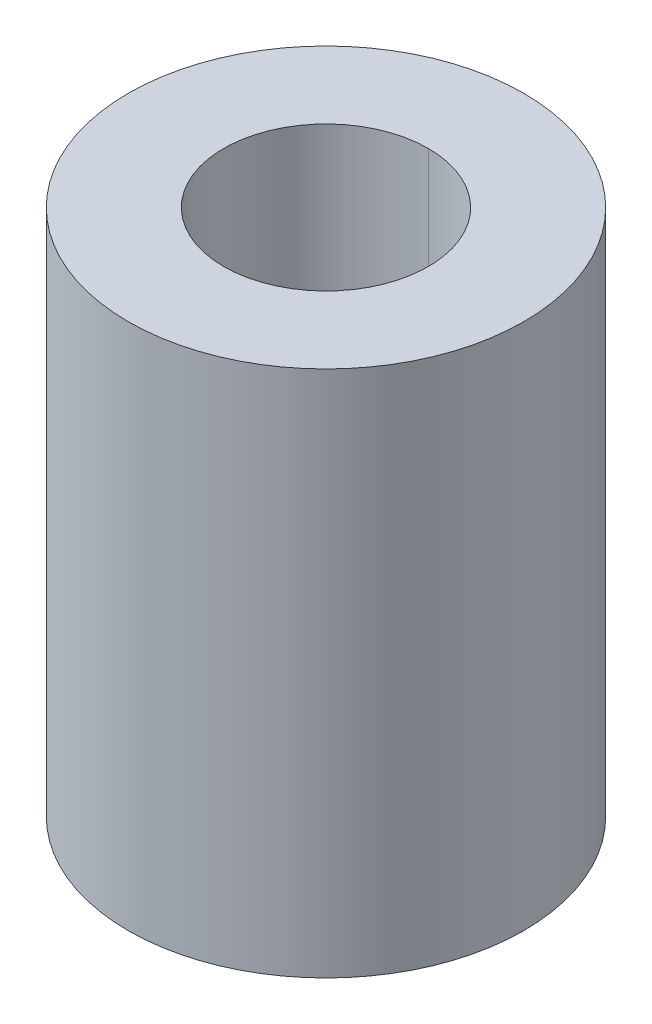
ISO-10303-21;
HEADER;
FILE_DESCRIPTION(('STEP AP214'),'2;1');
FILE_NAME('part.step','',(''),(''),'','','');
FILE_SCHEMA(('AUTOMOTIVE_DESIGN { 1 0 10303 214 1 1 1 1 }'));
ENDSEC;
DATA;
#1=APPLICATION_CONTEXT('core data for automotive mechanical design processes');
#2=APPLICATION_PROTOCOL_DEFINITION('international standard','automotive_design',2000,#1);
#3=PRODUCT_CONTEXT('',#1,'mechanical');
#4=PRODUCT('Part','Part','',(#3));
#5=PRODUCT_RELATED_PRODUCT_CATEGORY('part','',(#4));
#6=PRODUCT_DEFINITION_FORMATION('','',#4);
#7=PRODUCT_DEFINITION_CONTEXT('part definition',#1,'design');
#8=PRODUCT_DEFINITION('design','',#6,#7);
#9=PRODUCT_DEFINITION_SHAPE('','',#8);
#10=(LENGTH_UNIT() NAMED_UNIT(*) SI_UNIT(.MILLI.,.METRE.));
#11=(NAMED_UNIT(*) PLANE_ANGLE_UNIT() SI_UNIT($,.RADIAN.));
#12=(NAMED_UNIT(*) SI_UNIT($,.STERADIAN.) SOLID_ANGLE_UNIT());
#13=UNCERTAINTY_MEASURE_WITH_UNIT(LENGTH_MEASURE(1.E-05),#10,'distance_accuracy_value','');
#14=(GEOMETRIC_REPRESENTATION_CONTEXT(3) GLOBAL_UNCERTAINTY_ASSIGNED_CONTEXT((#13)) GLOBAL_UNIT_ASSIGNED_CONTEXT((#10,
#11,#12)) REPRESENTATION_CONTEXT('',''));
#15=CARTESIAN_POINT('',(0.,0.,0.));
#16=DIRECTION('',(0.,0.,1.));
#17=DIRECTION('',(1.,0.,0.));
#18=AXIS2_PLACEMENT_3D('',#15,#16,#17);
#19=CARTESIAN_POINT('',(0.,6.35,0.));
#20=DIRECTION('',(0.,1.,0.));
#21=DIRECTION('',(1.,0.,0.));
#22=AXIS2_PLACEMENT_3D('',#19,#20,#21);
#23=PLANE('',#22);
#24=CARTESIAN_POINT('',(0.,6.35,0.));
#25=DIRECTION('',(0.,1.,0.));
#26=DIRECTION('',(0.,0.,1.));
#27=AXIS2_PLACEMENT_3D('',#24,#25,#26);
#28=CIRCLE('',#27,2.4638);
#29=CARTESIAN_POINT('',(0.,6.35,-2.4638));
#30=VERTEX_POINT('',#29);
#31=CARTESIAN_POINT('',(0.,6.35,2.4638));
#32=VERTEX_POINT('',#31);
#33=EDGE_CURVE('E61',#30,#32,#28,.T.);
#34=ORIENTED_EDGE('',*,*,#33,.F.);
#35=CARTESIAN_POINT('',(0.,6.35,0.));
#36=DIRECTION('',(0.,1.,0.));
#37=DIRECTION('',(0.,0.,1.));
#38=AXIS2_PLACEMENT_3D('',#35,#36,#37);
#39=CIRCLE('',#38,2.4638);
#40=EDGE_CURVE('E11',#32,#30,#39,.T.);
#41=ORIENTED_EDGE('',*,*,#40,.F.);
#42=EDGE_LOOP('',(#34,#41));
#43=FACE_BOUND('',#42,.T.);
#44=CARTESIAN_POINT('',(0.,6.35,0.));
#45=DIRECTION('',(0.,1.,0.));
#46=DIRECTION('',(0.,0.,1.));
#47=AXIS2_PLACEMENT_3D('',#44,#45,#46);
#48=CIRCLE('',#47,4.7625);
#49=CARTESIAN_POINT('',(0.,6.35,4.7625));
#50=VERTEX_POINT('',#49);
#51=EDGE_CURVE('E98',#50,#50,#48,.T.);
#52=ORIENTED_EDGE('',*,*,#51,.T.);
#53=EDGE_LOOP('',(#52));
#54=FACE_BOUND('',#53,.T.);
#55=ADVANCED_FACE('F42',(#43,#54),#23,.T.);
#56=CARTESIAN_POINT('',(0.,-6.35,0.));
#57=DIRECTION('',(0.,1.,0.));
#58=DIRECTION('',(1.,0.,0.));
#59=AXIS2_PLACEMENT_3D('',#56,#57,#58);
#60=PLANE('',#59);
#61=CARTESIAN_POINT('',(0.,-6.35,0.));
#62=DIRECTION('',(0.,1.,0.));
#63=DIRECTION('',(0.,0.,1.));
#64=AXIS2_PLACEMENT_3D('',#61,#62,#63);
#65=CIRCLE('',#64,2.4638);
#66=CARTESIAN_POINT('',(0.,-6.35,-2.4638));
#67=VERTEX_POINT('',#66);
#68=CARTESIAN_POINT('',(0.,-6.35,2.4638));
#69=VERTEX_POINT('',#68);
#70=EDGE_CURVE('E84',#67,#69,#65,.T.);
#71=ORIENTED_EDGE('',*,*,#70,.T.);
#72=CARTESIAN_POINT('',(0.,-6.35,0.));
#73=DIRECTION('',(0.,1.,0.));
#74=DIRECTION('',(0.,0.,1.));
#75=AXIS2_PLACEMENT_3D('',#72,#73,#74);
#76=CIRCLE('',#75,2.4638);
#77=EDGE_CURVE('E46',#69,#67,#76,.T.);
#78=ORIENTED_EDGE('',*,*,#77,.T.);
#79=EDGE_LOOP('',(#71,#78));
#80=FACE_BOUND('',#79,.T.);
#81=CARTESIAN_POINT('',(0.,-6.35,0.));
#82=DIRECTION('',(0.,1.,0.));
#83=DIRECTION('',(0.,0.,1.));
#84=AXIS2_PLACEMENT_3D('',#81,#82,#83);
#85=CIRCLE('',#84,4.7625);
#86=CARTESIAN_POINT('',(0.,-6.35,4.7625));
#87=VERTEX_POINT('',#86);
#88=EDGE_CURVE('E85',#87,#87,#85,.T.);
#89=ORIENTED_EDGE('',*,*,#88,.F.);
#90=EDGE_LOOP('',(#89));
#91=FACE_BOUND('',#90,.T.);
#92=ADVANCED_FACE('F44',(#80,#91),#60,.F.);
#93=CARTESIAN_POINT('',(0.,6.35,0.));
#94=DIRECTION('',(0.,-1.,0.));
#95=DIRECTION('',(0.,0.,-1.));
#96=AXIS2_PLACEMENT_3D('',#93,#94,#95);
#97=CYLINDRICAL_SURFACE('',#96,2.4638);
#98=DIRECTION('',(0.,-1.,0.));
#99=VECTOR('',#98,1.);
#100=CARTESIAN_POINT('',(0.,6.35,2.4638));
#101=LINE('',#100,#99);
#102=EDGE_CURVE('E79',#32,#69,#101,.T.);
#103=ORIENTED_EDGE('',*,*,#102,.F.);
#104=ORIENTED_EDGE('',*,*,#40,.T.);
#105=DIRECTION('',(0.,-1.,0.));
#106=VECTOR('',#105,1.);
#107=CARTESIAN_POINT('',(0.,6.35,-2.4638));
#108=LINE('',#107,#106);
#109=EDGE_CURVE('E52',#30,#67,#108,.T.);
#110=ORIENTED_EDGE('',*,*,#109,.T.);
#111=ORIENTED_EDGE('',*,*,#77,.F.);
#112=EDGE_LOOP('',(#103,#104,#110,#111));
#113=FACE_BOUND('',#112,.T.);
#114=ADVANCED_FACE('F78',(#113),#97,.F.);
#115=CARTESIAN_POINT('',(0.,6.35,0.));
#116=DIRECTION('',(0.,-1.,0.));
#117=DIRECTION('',(0.,0.,-1.));
#118=AXIS2_PLACEMENT_3D('',#115,#116,#117);
#119=CYLINDRICAL_SURFACE('',#118,2.4638);
#120=ORIENTED_EDGE('',*,*,#33,.T.);
#121=ORIENTED_EDGE('',*,*,#102,.T.);
#122=ORIENTED_EDGE('',*,*,#70,.F.);
#123=ORIENTED_EDGE('',*,*,#109,.F.);
#124=EDGE_LOOP('',(#120,#121,#122,#123));
#125=FACE_BOUND('',#124,.T.);
#126=ADVANCED_FACE('F86',(#125),#119,.F.);
#127=CARTESIAN_POINT('',(0.,-6.35,0.));
#128=DIRECTION('',(0.,1.,0.));
#129=DIRECTION('',(0.,0.,1.));
#130=AXIS2_PLACEMENT_3D('',#127,#128,#129);
#131=CYLINDRICAL_SURFACE('',#130,4.7625);
#132=ORIENTED_EDGE('',*,*,#88,.T.);
#133=EDGE_LOOP('',(#132));
#134=FACE_BOUND('',#133,.T.);
#135=ORIENTED_EDGE('',*,*,#51,.F.);
#136=EDGE_LOOP('',(#135));
#137=FACE_BOUND('',#136,.T.);
#138=ADVANCED_FACE('F104',(#134,#137),#131,.T.);
#139=CLOSED_SHELL('',(#55,#92,#114,#126,#138));
#140=MANIFOLD_SOLID_BREP('B2',#139);
#141=ADVANCED_BREP_SHAPE_REPRESENTATION('',(#18,#140),#14);
#142=SHAPE_DEFINITION_REPRESENTATION(#9,#141);
ENDSEC;
END-ISO-10303-21;
